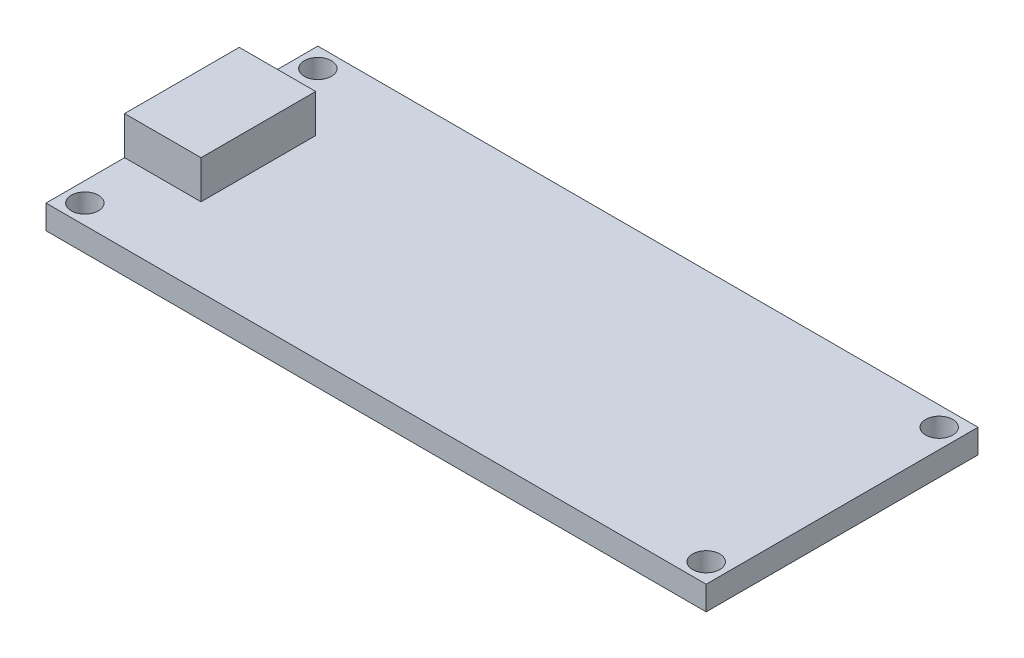
ISO-10303-21;
HEADER;
FILE_DESCRIPTION(('STEP AP214'),'2;1');
FILE_NAME('part.step','',(''),(''),'','','');
FILE_SCHEMA(('AUTOMOTIVE_DESIGN { 1 0 10303 214 1 1 1 1 }'));
ENDSEC;
DATA;
#1=APPLICATION_CONTEXT('core data for automotive mechanical design processes');
#2=APPLICATION_PROTOCOL_DEFINITION('international standard','automotive_design',2000,#1);
#3=PRODUCT_CONTEXT('',#1,'mechanical');
#4=PRODUCT('Part','Part','',(#3));
#5=PRODUCT_RELATED_PRODUCT_CATEGORY('part','',(#4));
#6=PRODUCT_DEFINITION_FORMATION('','',#4);
#7=PRODUCT_DEFINITION_CONTEXT('part definition',#1,'design');
#8=PRODUCT_DEFINITION('design','',#6,#7);
#9=PRODUCT_DEFINITION_SHAPE('','',#8);
#10=(LENGTH_UNIT() NAMED_UNIT(*) SI_UNIT(.MILLI.,.METRE.));
#11=(NAMED_UNIT(*) PLANE_ANGLE_UNIT() SI_UNIT($,.RADIAN.));
#12=(NAMED_UNIT(*) SI_UNIT($,.STERADIAN.) SOLID_ANGLE_UNIT());
#13=UNCERTAINTY_MEASURE_WITH_UNIT(LENGTH_MEASURE(1.E-05),#10,'distance_accuracy_value','');
#14=(GEOMETRIC_REPRESENTATION_CONTEXT(3) GLOBAL_UNCERTAINTY_ASSIGNED_CONTEXT((#13)) GLOBAL_UNIT_ASSIGNED_CONTEXT((#10,
#11,#12)) REPRESENTATION_CONTEXT('',''));
#15=CARTESIAN_POINT('',(0.,0.,0.));
#16=DIRECTION('',(0.,0.,1.));
#17=DIRECTION('',(1.,0.,0.));
#18=AXIS2_PLACEMENT_3D('',#15,#16,#17);
#19=CARTESIAN_POINT('',(0.,1.57,0.));
#20=DIRECTION('',(0.,-1.,0.));
#21=DIRECTION('',(0.,0.,-1.));
#22=AXIS2_PLACEMENT_3D('',#19,#20,#21);
#23=PLANE('',#22);
#24=DIRECTION('',(0.,0.,1.));
#25=VECTOR('',#24,1.);
#26=CARTESIAN_POINT('',(-38.6611627906976,1.57,-0.922965116279054));
#27=LINE('',#26,#25);
#28=CARTESIAN_POINT('',(-38.6611627906976,1.57,-18.7029651162791));
#29=VERTEX_POINT('',#28);
#30=CARTESIAN_POINT('',(-38.6611627906976,1.57,-13.562965116279));
#31=VERTEX_POINT('',#30);
#32=EDGE_CURVE('E153',#29,#31,#27,.T.);
#33=ORIENTED_EDGE('',*,*,#32,.T.);
#34=DIRECTION('',(1.,0.,0.));
#35=VECTOR('',#34,1.);
#36=CARTESIAN_POINT('',(0.,1.57,-13.5629651162791));
#37=LINE('',#36,#35);
#38=CARTESIAN_POINT('',(-33.6611627906976,1.57,-13.5629651162791));
#39=VERTEX_POINT('',#38);
#40=EDGE_CURVE('E50',#31,#39,#37,.T.);
#41=ORIENTED_EDGE('',*,*,#40,.T.);
#42=DIRECTION('',(0.,0.,1.));
#43=VECTOR('',#42,1.);
#44=CARTESIAN_POINT('',(-33.6611627906976,1.57,0.));
#45=LINE('',#44,#43);
#46=CARTESIAN_POINT('',(-33.6611627906976,1.57,-6.06296511627905));
#47=VERTEX_POINT('',#46);
#48=EDGE_CURVE('E341',#39,#47,#45,.T.);
#49=ORIENTED_EDGE('',*,*,#48,.T.);
#50=DIRECTION('',(1.,0.,0.));
#51=VECTOR('',#50,1.);
#52=CARTESIAN_POINT('',(0.,1.57,-6.06296511627905));
#53=LINE('',#52,#51);
#54=CARTESIAN_POINT('',(-38.6611627906976,1.57,-6.06296511627905));
#55=VERTEX_POINT('',#54);
#56=EDGE_CURVE('E56',#55,#47,#53,.T.);
#57=ORIENTED_EDGE('',*,*,#56,.F.);
#58=CARTESIAN_POINT('',(-38.6611627906976,1.57,-0.922965116279054));
#59=VERTEX_POINT('',#58);
#60=EDGE_CURVE('E122',#55,#59,#27,.T.);
#61=ORIENTED_EDGE('',*,*,#60,.T.);
#62=DIRECTION('',(1.,0.,0.));
#63=VECTOR('',#62,1.);
#64=CARTESIAN_POINT('',(-38.6611627906976,1.57,-0.922965116279054));
#65=LINE('',#64,#63);
#66=CARTESIAN_POINT('',(4.51883720930236,1.57,-0.922965116279054));
#67=VERTEX_POINT('',#66);
#68=EDGE_CURVE('E155',#59,#67,#65,.T.);
#69=ORIENTED_EDGE('',*,*,#68,.T.);
#70=DIRECTION('',(0.,0.,-1.));
#71=VECTOR('',#70,1.);
#72=CARTESIAN_POINT('',(4.51883720930236,1.57,-0.922965116279054));
#73=LINE('',#72,#71);
#74=CARTESIAN_POINT('',(4.51883720930236,1.57,-18.7029651162791));
#75=VERTEX_POINT('',#74);
#76=EDGE_CURVE('E157',#67,#75,#73,.T.);
#77=ORIENTED_EDGE('',*,*,#76,.T.);
#78=DIRECTION('',(-1.,0.,0.));
#79=VECTOR('',#78,1.);
#80=CARTESIAN_POINT('',(-38.6611627906976,1.57,-18.7029651162791));
#81=LINE('',#80,#79);
#82=EDGE_CURVE('E159',#75,#29,#81,.T.);
#83=ORIENTED_EDGE('',*,*,#82,.T.);
#84=EDGE_LOOP('',(#33,#41,#49,#57,#61,#69,#77,#83));
#85=FACE_BOUND('',#84,.T.);
#86=CARTESIAN_POINT('',(-37.3911627906976,1.57,-17.4329651162791));
#87=DIRECTION('',(0.,1.,0.));
#88=DIRECTION('',(0.,0.,1.));
#89=AXIS2_PLACEMENT_3D('',#86,#87,#88);
#90=CIRCLE('',#89,0.889000000000003);
#91=CARTESIAN_POINT('',(-37.3911627906976,1.57,-16.5439651162791));
#92=VERTEX_POINT('',#91);
#93=EDGE_CURVE('E147',#92,#92,#90,.T.);
#94=ORIENTED_EDGE('',*,*,#93,.F.);
#95=EDGE_LOOP('',(#94));
#96=FACE_BOUND('',#95,.T.);
#97=CARTESIAN_POINT('',(-37.3911627906976,1.57,-2.19296511627905));
#98=DIRECTION('',(0.,1.,0.));
#99=DIRECTION('',(0.,0.,1.));
#100=AXIS2_PLACEMENT_3D('',#97,#98,#99);
#101=CIRCLE('',#100,0.889000000000003);
#102=CARTESIAN_POINT('',(-37.3911627906976,1.57,-1.30396511627905));
#103=VERTEX_POINT('',#102);
#104=EDGE_CURVE('E141',#103,#103,#101,.T.);
#105=ORIENTED_EDGE('',*,*,#104,.F.);
#106=EDGE_LOOP('',(#105));
#107=FACE_BOUND('',#106,.T.);
#108=CARTESIAN_POINT('',(3.24883720930236,1.57,-2.19296511627905));
#109=DIRECTION('',(0.,1.,0.));
#110=DIRECTION('',(0.,0.,1.));
#111=AXIS2_PLACEMENT_3D('',#108,#109,#110);
#112=CIRCLE('',#111,0.889);
#113=CARTESIAN_POINT('',(3.24883720930236,1.57,-1.30396511627905));
#114=VERTEX_POINT('',#113);
#115=EDGE_CURVE('E135',#114,#114,#112,.T.);
#116=ORIENTED_EDGE('',*,*,#115,.F.);
#117=EDGE_LOOP('',(#116));
#118=FACE_BOUND('',#117,.T.);
#119=CARTESIAN_POINT('',(3.24883720930236,1.57,-17.4329651162791));
#120=DIRECTION('',(0.,1.,0.));
#121=DIRECTION('',(0.,0.,1.));
#122=AXIS2_PLACEMENT_3D('',#119,#120,#121);
#123=CIRCLE('',#122,0.889);
#124=CARTESIAN_POINT('',(3.24883720930236,1.57,-16.5439651162791));
#125=VERTEX_POINT('',#124);
#126=EDGE_CURVE('E126',#125,#125,#123,.T.);
#127=ORIENTED_EDGE('',*,*,#126,.F.);
#128=EDGE_LOOP('',(#127));
#129=FACE_BOUND('',#128,.T.);
#130=ADVANCED_FACE('F35',(#85,#96,#107,#118,#129),#23,.F.);
#131=CARTESIAN_POINT('',(0.,0.,0.));
#132=DIRECTION('',(0.,-1.,0.));
#133=DIRECTION('',(0.,0.,-1.));
#134=AXIS2_PLACEMENT_3D('',#131,#132,#133);
#135=PLANE('',#134);
#136=CARTESIAN_POINT('',(3.24883720930236,0.,-2.19296511627905));
#137=DIRECTION('',(0.,1.,0.));
#138=DIRECTION('',(0.,0.,1.));
#139=AXIS2_PLACEMENT_3D('',#136,#137,#138);
#140=CIRCLE('',#139,0.889);
#141=CARTESIAN_POINT('',(3.24883720930236,0.,-1.30396511627905));
#142=VERTEX_POINT('',#141);
#143=EDGE_CURVE('E133',#142,#142,#140,.T.);
#144=ORIENTED_EDGE('',*,*,#143,.T.);
#145=EDGE_LOOP('',(#144));
#146=FACE_BOUND('',#145,.T.);
#147=CARTESIAN_POINT('',(-37.3911627906976,0.,-17.4329651162791));
#148=DIRECTION('',(0.,1.,0.));
#149=DIRECTION('',(0.,0.,1.));
#150=AXIS2_PLACEMENT_3D('',#147,#148,#149);
#151=CIRCLE('',#150,0.889000000000003);
#152=CARTESIAN_POINT('',(-37.3911627906976,0.,-16.5439651162791));
#153=VERTEX_POINT('',#152);
#154=EDGE_CURVE('E144',#153,#153,#151,.T.);
#155=ORIENTED_EDGE('',*,*,#154,.T.);
#156=EDGE_LOOP('',(#155));
#157=FACE_BOUND('',#156,.T.);
#158=DIRECTION('',(0.,0.,1.));
#159=VECTOR('',#158,1.);
#160=CARTESIAN_POINT('',(-38.6611627906976,0.,-0.922965116279054));
#161=LINE('',#160,#159);
#162=CARTESIAN_POINT('',(-38.6611627906976,0.,-18.7029651162791));
#163=VERTEX_POINT('',#162);
#164=CARTESIAN_POINT('',(-38.6611627906976,0.,-0.922965116279054));
#165=VERTEX_POINT('',#164);
#166=EDGE_CURVE('E150',#163,#165,#161,.T.);
#167=ORIENTED_EDGE('',*,*,#166,.F.);
#168=DIRECTION('',(-1.,0.,0.));
#169=VECTOR('',#168,1.);
#170=CARTESIAN_POINT('',(-38.6611627906976,0.,-18.7029651162791));
#171=LINE('',#170,#169);
#172=CARTESIAN_POINT('',(4.51883720930236,0.,-18.7029651162791));
#173=VERTEX_POINT('',#172);
#174=EDGE_CURVE('E167',#173,#163,#171,.T.);
#175=ORIENTED_EDGE('',*,*,#174,.F.);
#176=DIRECTION('',(0.,0.,-1.));
#177=VECTOR('',#176,1.);
#178=CARTESIAN_POINT('',(4.51883720930236,0.,-0.922965116279054));
#179=LINE('',#178,#177);
#180=CARTESIAN_POINT('',(4.51883720930236,0.,-0.922965116279054));
#181=VERTEX_POINT('',#180);
#182=EDGE_CURVE('E165',#181,#173,#179,.T.);
#183=ORIENTED_EDGE('',*,*,#182,.F.);
#184=DIRECTION('',(1.,0.,0.));
#185=VECTOR('',#184,1.);
#186=CARTESIAN_POINT('',(-38.6611627906976,0.,-0.922965116279054));
#187=LINE('',#186,#185);
#188=EDGE_CURVE('E163',#165,#181,#187,.T.);
#189=ORIENTED_EDGE('',*,*,#188,.F.);
#190=EDGE_LOOP('',(#167,#175,#183,#189));
#191=FACE_BOUND('',#190,.T.);
#192=CARTESIAN_POINT('',(-37.3911627906976,0.,-2.19296511627905));
#193=DIRECTION('',(0.,1.,0.));
#194=DIRECTION('',(0.,0.,1.));
#195=AXIS2_PLACEMENT_3D('',#192,#193,#194);
#196=CIRCLE('',#195,0.889000000000003);
#197=CARTESIAN_POINT('',(-37.3911627906976,0.,-1.30396511627905));
#198=VERTEX_POINT('',#197);
#199=EDGE_CURVE('E138',#198,#198,#196,.T.);
#200=ORIENTED_EDGE('',*,*,#199,.T.);
#201=EDGE_LOOP('',(#200));
#202=FACE_BOUND('',#201,.T.);
#203=CARTESIAN_POINT('',(3.24883720930236,0.,-17.4329651162791));
#204=DIRECTION('',(0.,1.,0.));
#205=DIRECTION('',(0.,0.,1.));
#206=AXIS2_PLACEMENT_3D('',#203,#204,#205);
#207=CIRCLE('',#206,0.889);
#208=CARTESIAN_POINT('',(3.24883720930236,0.,-16.5439651162791));
#209=VERTEX_POINT('',#208);
#210=EDGE_CURVE('E123',#209,#209,#207,.T.);
#211=ORIENTED_EDGE('',*,*,#210,.T.);
#212=EDGE_LOOP('',(#211));
#213=FACE_BOUND('',#212,.T.);
#214=ADVANCED_FACE('F185',(#146,#157,#191,#202,#213),#135,.T.);
#215=CARTESIAN_POINT('',(-38.6611627906976,1.57,-0.922965116279054));
#216=DIRECTION('',(1.,0.,0.));
#217=DIRECTION('',(0.,0.,-1.));
#218=AXIS2_PLACEMENT_3D('',#215,#216,#217);
#219=PLANE('',#218);
#220=ORIENTED_EDGE('',*,*,#166,.T.);
#221=DIRECTION('',(0.,-1.,0.));
#222=VECTOR('',#221,1.);
#223=CARTESIAN_POINT('',(-38.6611627906976,1.57,-0.922965116279054));
#224=LINE('',#223,#222);
#225=EDGE_CURVE('E11',#59,#165,#224,.T.);
#226=ORIENTED_EDGE('',*,*,#225,.F.);
#227=ORIENTED_EDGE('',*,*,#60,.F.);
#228=DIRECTION('',(0.,-1.,0.));
#229=VECTOR('',#228,1.);
#230=CARTESIAN_POINT('',(-38.6611627906976,4.07,-6.06296511627905));
#231=LINE('',#230,#229);
#232=CARTESIAN_POINT('',(-38.6611627906976,4.07,-6.06296511627905));
#233=VERTEX_POINT('',#232);
#234=EDGE_CURVE('E103',#233,#55,#231,.T.);
#235=ORIENTED_EDGE('',*,*,#234,.F.);
#236=DIRECTION('',(0.,0.,1.));
#237=VECTOR('',#236,1.);
#238=CARTESIAN_POINT('',(-38.6611627906976,4.07,0.));
#239=LINE('',#238,#237);
#240=CARTESIAN_POINT('',(-38.6611627906976,4.07,-13.5629651162791));
#241=VERTEX_POINT('',#240);
#242=EDGE_CURVE('E110',#241,#233,#239,.T.);
#243=ORIENTED_EDGE('',*,*,#242,.F.);
#244=DIRECTION('',(0.,-1.,0.));
#245=VECTOR('',#244,1.);
#246=CARTESIAN_POINT('',(-38.6611627906976,4.07,-13.5629651162791));
#247=LINE('',#246,#245);
#248=EDGE_CURVE('E192',#241,#31,#247,.T.);
#249=ORIENTED_EDGE('',*,*,#248,.T.);
#250=ORIENTED_EDGE('',*,*,#32,.F.);
#251=DIRECTION('',(0.,-1.,0.));
#252=VECTOR('',#251,1.);
#253=CARTESIAN_POINT('',(-38.6611627906976,1.57,-18.7029651162791));
#254=LINE('',#253,#252);
#255=EDGE_CURVE('E161',#29,#163,#254,.T.);
#256=ORIENTED_EDGE('',*,*,#255,.T.);
#257=EDGE_LOOP('',(#220,#226,#227,#235,#243,#249,#250,#256));
#258=FACE_BOUND('',#257,.T.);
#259=ADVANCED_FACE('F37',(#258),#219,.F.);
#260=CARTESIAN_POINT('',(-38.6611627906976,1.57,-0.922965116279054));
#261=DIRECTION('',(0.,0.,-1.));
#262=DIRECTION('',(-1.,0.,0.));
#263=AXIS2_PLACEMENT_3D('',#260,#261,#262);
#264=PLANE('',#263);
#265=ORIENTED_EDGE('',*,*,#188,.T.);
#266=DIRECTION('',(0.,-1.,0.));
#267=VECTOR('',#266,1.);
#268=CARTESIAN_POINT('',(4.51883720930236,1.57,-0.922965116279054));
#269=LINE('',#268,#267);
#270=EDGE_CURVE('E43',#67,#181,#269,.T.);
#271=ORIENTED_EDGE('',*,*,#270,.F.);
#272=ORIENTED_EDGE('',*,*,#68,.F.);
#273=ORIENTED_EDGE('',*,*,#225,.T.);
#274=EDGE_LOOP('',(#265,#271,#272,#273));
#275=FACE_BOUND('',#274,.T.);
#276=ADVANCED_FACE('F194',(#275),#264,.F.);
#277=CARTESIAN_POINT('',(4.51883720930236,1.57,-0.922965116279054));
#278=DIRECTION('',(-1.,0.,0.));
#279=DIRECTION('',(0.,0.,1.));
#280=AXIS2_PLACEMENT_3D('',#277,#278,#279);
#281=PLANE('',#280);
#282=ORIENTED_EDGE('',*,*,#182,.T.);
#283=DIRECTION('',(0.,-1.,0.));
#284=VECTOR('',#283,1.);
#285=CARTESIAN_POINT('',(4.51883720930236,1.57,-18.7029651162791));
#286=LINE('',#285,#284);
#287=EDGE_CURVE('E171',#75,#173,#286,.T.);
#288=ORIENTED_EDGE('',*,*,#287,.F.);
#289=ORIENTED_EDGE('',*,*,#76,.F.);
#290=ORIENTED_EDGE('',*,*,#270,.T.);
#291=EDGE_LOOP('',(#282,#288,#289,#290));
#292=FACE_BOUND('',#291,.T.);
#293=ADVANCED_FACE('F178',(#292),#281,.F.);
#294=CARTESIAN_POINT('',(-38.6611627906976,1.57,-18.7029651162791));
#295=DIRECTION('',(0.,0.,1.));
#296=DIRECTION('',(1.,0.,0.));
#297=AXIS2_PLACEMENT_3D('',#294,#295,#296);
#298=PLANE('',#297);
#299=ORIENTED_EDGE('',*,*,#174,.T.);
#300=ORIENTED_EDGE('',*,*,#255,.F.);
#301=ORIENTED_EDGE('',*,*,#82,.F.);
#302=ORIENTED_EDGE('',*,*,#287,.T.);
#303=EDGE_LOOP('',(#299,#300,#301,#302));
#304=FACE_BOUND('',#303,.T.);
#305=ADVANCED_FACE('F189',(#304),#298,.F.);
#306=CARTESIAN_POINT('',(-37.3911627906976,1.57,-17.4329651162791));
#307=DIRECTION('',(0.,-1.,0.));
#308=DIRECTION('',(0.,0.,-1.));
#309=AXIS2_PLACEMENT_3D('',#306,#307,#308);
#310=CYLINDRICAL_SURFACE('',#309,0.889000000000003);
#311=ORIENTED_EDGE('',*,*,#93,.T.);
#312=EDGE_LOOP('',(#311));
#313=FACE_BOUND('',#312,.T.);
#314=ORIENTED_EDGE('',*,*,#154,.F.);
#315=EDGE_LOOP('',(#314));
#316=FACE_BOUND('',#315,.T.);
#317=ADVANCED_FACE('F209',(#313,#316),#310,.F.);
#318=CARTESIAN_POINT('',(-37.3911627906976,1.57,-2.19296511627905));
#319=DIRECTION('',(0.,-1.,0.));
#320=DIRECTION('',(0.,0.,-1.));
#321=AXIS2_PLACEMENT_3D('',#318,#319,#320);
#322=CYLINDRICAL_SURFACE('',#321,0.889000000000003);
#323=ORIENTED_EDGE('',*,*,#104,.T.);
#324=EDGE_LOOP('',(#323));
#325=FACE_BOUND('',#324,.T.);
#326=ORIENTED_EDGE('',*,*,#199,.F.);
#327=EDGE_LOOP('',(#326));
#328=FACE_BOUND('',#327,.T.);
#329=ADVANCED_FACE('F216',(#325,#328),#322,.F.);
#330=CARTESIAN_POINT('',(3.24883720930236,1.57,-2.19296511627905));
#331=DIRECTION('',(0.,-1.,0.));
#332=DIRECTION('',(0.,0.,-1.));
#333=AXIS2_PLACEMENT_3D('',#330,#331,#332);
#334=CYLINDRICAL_SURFACE('',#333,0.889);
#335=ORIENTED_EDGE('',*,*,#115,.T.);
#336=EDGE_LOOP('',(#335));
#337=FACE_BOUND('',#336,.T.);
#338=ORIENTED_EDGE('',*,*,#143,.F.);
#339=EDGE_LOOP('',(#338));
#340=FACE_BOUND('',#339,.T.);
#341=ADVANCED_FACE('F221',(#337,#340),#334,.F.);
#342=CARTESIAN_POINT('',(3.24883720930236,1.57,-17.4329651162791));
#343=DIRECTION('',(0.,-1.,0.));
#344=DIRECTION('',(0.,0.,-1.));
#345=AXIS2_PLACEMENT_3D('',#342,#343,#344);
#346=CYLINDRICAL_SURFACE('',#345,0.889);
#347=ORIENTED_EDGE('',*,*,#126,.T.);
#348=EDGE_LOOP('',(#347));
#349=FACE_BOUND('',#348,.T.);
#350=ORIENTED_EDGE('',*,*,#210,.F.);
#351=EDGE_LOOP('',(#350));
#352=FACE_BOUND('',#351,.T.);
#353=ADVANCED_FACE('F234',(#349,#352),#346,.F.);
#354=CARTESIAN_POINT('',(0.,4.07,-6.06296511627905));
#355=DIRECTION('',(0.,0.,-1.));
#356=DIRECTION('',(-1.,0.,0.));
#357=AXIS2_PLACEMENT_3D('',#354,#355,#356);
#358=PLANE('',#357);
#359=ORIENTED_EDGE('',*,*,#56,.T.);
#360=DIRECTION('',(0.,-1.,0.));
#361=VECTOR('',#360,1.);
#362=CARTESIAN_POINT('',(-33.6611627906976,4.07,-6.06296511627905));
#363=LINE('',#362,#361);
#364=CARTESIAN_POINT('',(-33.6611627906976,4.07,-6.06296511627905));
#365=VERTEX_POINT('',#364);
#366=EDGE_CURVE('E105',#365,#47,#363,.T.);
#367=ORIENTED_EDGE('',*,*,#366,.F.);
#368=DIRECTION('',(1.,0.,0.));
#369=VECTOR('',#368,1.);
#370=CARTESIAN_POINT('',(0.,4.07,-6.06296511627905));
#371=LINE('',#370,#369);
#372=EDGE_CURVE('E99',#233,#365,#371,.T.);
#373=ORIENTED_EDGE('',*,*,#372,.F.);
#374=ORIENTED_EDGE('',*,*,#234,.T.);
#375=EDGE_LOOP('',(#359,#367,#373,#374));
#376=FACE_BOUND('',#375,.T.);
#377=ADVANCED_FACE('F101',(#376),#358,.F.);
#378=CARTESIAN_POINT('',(-33.6611627906976,4.07,0.));
#379=DIRECTION('',(1.,0.,0.));
#380=DIRECTION('',(0.,0.,-1.));
#381=AXIS2_PLACEMENT_3D('',#378,#379,#380);
#382=PLANE('',#381);
#383=ORIENTED_EDGE('',*,*,#48,.F.);
#384=DIRECTION('',(0.,-1.,0.));
#385=VECTOR('',#384,1.);
#386=CARTESIAN_POINT('',(-33.6611627906976,4.07,-13.5629651162791));
#387=LINE('',#386,#385);
#388=CARTESIAN_POINT('',(-33.6611627906976,4.07,-13.5629651162791));
#389=VERTEX_POINT('',#388);
#390=EDGE_CURVE('E128',#389,#39,#387,.T.);
#391=ORIENTED_EDGE('',*,*,#390,.F.);
#392=DIRECTION('',(0.,0.,1.));
#393=VECTOR('',#392,1.);
#394=CARTESIAN_POINT('',(-33.6611627906976,4.07,0.));
#395=LINE('',#394,#393);
#396=EDGE_CURVE('E109',#389,#365,#395,.T.);
#397=ORIENTED_EDGE('',*,*,#396,.T.);
#398=ORIENTED_EDGE('',*,*,#366,.T.);
#399=EDGE_LOOP('',(#383,#391,#397,#398));
#400=FACE_BOUND('',#399,.T.);
#401=ADVANCED_FACE('F244',(#400),#382,.T.);
#402=CARTESIAN_POINT('',(0.,4.07,-13.5629651162791));
#403=DIRECTION('',(0.,0.,-1.));
#404=DIRECTION('',(-1.,0.,0.));
#405=AXIS2_PLACEMENT_3D('',#402,#403,#404);
#406=PLANE('',#405);
#407=ORIENTED_EDGE('',*,*,#40,.F.);
#408=ORIENTED_EDGE('',*,*,#248,.F.);
#409=DIRECTION('',(1.,0.,0.));
#410=VECTOR('',#409,1.);
#411=CARTESIAN_POINT('',(0.,4.07,-13.5629651162791));
#412=LINE('',#411,#410);
#413=EDGE_CURVE('E116',#241,#389,#412,.T.);
#414=ORIENTED_EDGE('',*,*,#413,.T.);
#415=ORIENTED_EDGE('',*,*,#390,.T.);
#416=EDGE_LOOP('',(#407,#408,#414,#415));
#417=FACE_BOUND('',#416,.T.);
#418=ADVANCED_FACE('F251',(#417),#406,.T.);
#419=CARTESIAN_POINT('',(0.,4.07,0.));
#420=DIRECTION('',(0.,1.,0.));
#421=DIRECTION('',(0.,0.,1.));
#422=AXIS2_PLACEMENT_3D('',#419,#420,#421);
#423=PLANE('',#422);
#424=ORIENTED_EDGE('',*,*,#242,.T.);
#425=ORIENTED_EDGE('',*,*,#372,.T.);
#426=ORIENTED_EDGE('',*,*,#396,.F.);
#427=ORIENTED_EDGE('',*,*,#413,.F.);
#428=EDGE_LOOP('',(#424,#425,#426,#427));
#429=FACE_BOUND('',#428,.T.);
#430=ADVANCED_FACE('F114',(#429),#423,.T.);
#431=CLOSED_SHELL('',(#130,#214,#259,#276,#293,#305,#317,#329,#341,#353,#377,#401,#418,#430));
#432=MANIFOLD_SOLID_BREP('B2',#431);
#433=ADVANCED_BREP_SHAPE_REPRESENTATION('',(#18,#432),#14);
#434=SHAPE_DEFINITION_REPRESENTATION(#9,#433);
ENDSEC;
END-ISO-10303-21;
